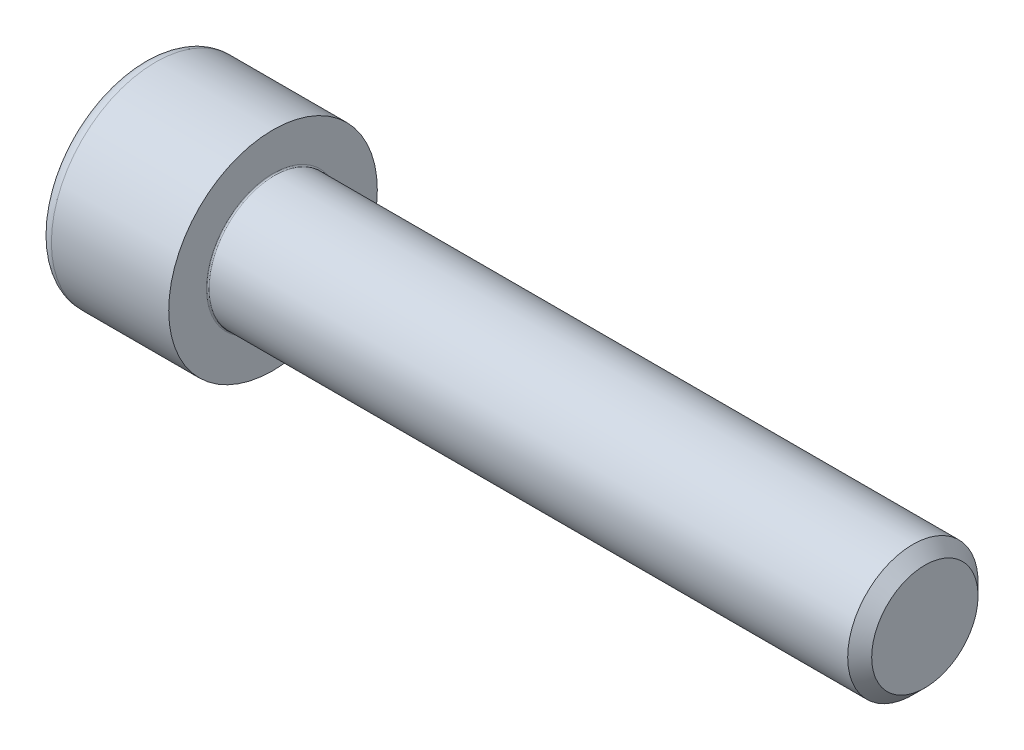
ISO-10303-21;
HEADER;
FILE_DESCRIPTION(('STEP AP214'),'2;1');
FILE_NAME('part.step','',(''),(''),'','','');
FILE_SCHEMA(('AUTOMOTIVE_DESIGN { 1 0 10303 214 1 1 1 1 }'));
ENDSEC;
DATA;
#1=APPLICATION_CONTEXT('core data for automotive mechanical design processes');
#2=APPLICATION_PROTOCOL_DEFINITION('international standard','automotive_design',2000,#1);
#3=PRODUCT_CONTEXT('',#1,'mechanical');
#4=PRODUCT('Part','Part','',(#3));
#5=PRODUCT_RELATED_PRODUCT_CATEGORY('part','',(#4));
#6=PRODUCT_DEFINITION_FORMATION('','',#4);
#7=PRODUCT_DEFINITION_CONTEXT('part definition',#1,'design');
#8=PRODUCT_DEFINITION('design','',#6,#7);
#9=PRODUCT_DEFINITION_SHAPE('','',#8);
#10=(LENGTH_UNIT() NAMED_UNIT(*) SI_UNIT(.MILLI.,.METRE.));
#11=(NAMED_UNIT(*) PLANE_ANGLE_UNIT() SI_UNIT($,.RADIAN.));
#12=(NAMED_UNIT(*) SI_UNIT($,.STERADIAN.) SOLID_ANGLE_UNIT());
#13=UNCERTAINTY_MEASURE_WITH_UNIT(LENGTH_MEASURE(1.E-05),#10,'distance_accuracy_value','');
#14=(GEOMETRIC_REPRESENTATION_CONTEXT(3) GLOBAL_UNCERTAINTY_ASSIGNED_CONTEXT((#13)) GLOBAL_UNIT_ASSIGNED_CONTEXT((#10,
#11,#12)) REPRESENTATION_CONTEXT('',''));
#15=CARTESIAN_POINT('',(0.,0.,0.));
#16=DIRECTION('',(0.,0.,1.));
#17=DIRECTION('',(1.,0.,0.));
#18=AXIS2_PLACEMENT_3D('',#15,#16,#17);
#19=CARTESIAN_POINT('',(-5.01600000268354,0.,0.));
#20=DIRECTION('',(-1.,0.,0.));
#21=DIRECTION('',(0.,0.,1.));
#22=AXIS2_PLACEMENT_3D('',#19,#20,#21);
#23=CONICAL_SURFACE('',#22,4.64651496463375,1.04719754991928);
#24=CARTESIAN_POINT('',(-2.3333333294886,-2.27373675443232E-10,0.));
#25=VERTEX_POINT('',#24);
#26=VERTEX_LOOP('',#25);
#27=FACE_BOUND('',#26,.T.);
#28=CARTESIAN_POINT('',(-5.00000000298437,4.00000000067974,2.30940107589699));
#29=CARTESIAN_POINT('',(-4.94139109334909,4.00000000024413,2.10643269365816));
#30=CARTESIAN_POINT('',(-4.88808935726585,4.00000000006543,1.90171229126235));
#31=CARTESIAN_POINT('',(-4.79505277770829,3.99999999993441,1.48872688965628));
#32=CARTESIAN_POINT('',(-4.75535084345693,3.99999999998264,1.28045455488328));
#33=CARTESIAN_POINT('',(-4.6935519205199,4.00000000001693,0.866490899976153));
#34=CARTESIAN_POINT('',(-4.67104357779146,4.00000000000452,0.660863255615086));
#35=CARTESIAN_POINT('',(-4.64417833884907,3.99999999999549,0.248640925676743));
#36=CARTESIAN_POINT('',(-4.63979919055683,3.99999999999887,0.0420477373874973));
#37=CARTESIAN_POINT('',(-4.64893258300802,4.00000000000099,-0.343949471957239));
#38=CARTESIAN_POINT('',(-4.66020257317891,4.00000000000027,-0.523411415039717));
#39=CARTESIAN_POINT('',(-4.69591460428945,3.99999999999974,-0.88116616517895));
#40=CARTESIAN_POINT('',(-4.72036883244939,3.99999999999993,-1.0594577357811));
#41=CARTESIAN_POINT('',(-4.78149966971878,4.00000000000008,-1.41794949444256));
#42=CARTESIAN_POINT('',(-4.81843528755097,4.00000000000004,-1.59810433342007));
#43=CARTESIAN_POINT('',(-4.90226352494454,3.99999999999996,-1.95572777908572));
#44=CARTESIAN_POINT('',(-4.94913646084931,3.99999999999992,-2.13320096380937));
#45=CARTESIAN_POINT('',(-5.00000000342637,4.,-2.30940107588652));
#46=B_SPLINE_CURVE_WITH_KNOTS('',3,(#28,#29,#30,#31,#32,#33,#34,#35,#36,#37,#38,#39,#40,#41,#42,
#43,#44,#45),.UNSPECIFIED.,.F.,.F.,(4,2,2,2,2,2,2,2,4),(0.,0.634032023238744,1.26958763432741,
1.88941521265626,2.50848177821251,3.04741556518231,3.58684838701404,4.13824324394022,
4.68855594552163),.UNSPECIFIED.);
#47=CARTESIAN_POINT('',(-5.00000000339516,3.99999999957561,2.30940107651348));
#48=VERTEX_POINT('',#47);
#49=CARTESIAN_POINT('',(-5.00000000353662,4.,-2.30940107626845));
#50=VERTEX_POINT('',#49);
#51=EDGE_CURVE('E21',#48,#50,#46,.T.);
#52=ORIENTED_EDGE('',*,*,#51,.T.);
#53=CARTESIAN_POINT('',(-5.00000000298437,3.99999999959378,-2.30940107777793));
#54=CARTESIAN_POINT('',(-4.9413910933491,3.82422422419212,-2.4108852685201));
#55=CARTESIAN_POINT('',(-4.88808935726585,3.64693115495502,-2.51324546956325));
#56=CARTESIAN_POINT('',(-4.79505277770829,3.28927530570654,-2.71973817025281));
#57=CARTESIAN_POINT('',(-4.75535084345693,3.10890617291174,-2.82387433768108));
#58=CARTESIAN_POINT('',(-4.6935519205199,2.75040313153586,-3.03085616516434));
#59=CARTESIAN_POINT('',(-4.67104357779146,2.57232436779261,-3.13366998733412));
#60=CARTESIAN_POINT('',(-4.64417833884907,2.21532935805429,-3.33978115229548));
#61=CARTESIAN_POINT('',(-4.63979919055682,2.03641440874867,-3.44307774644303));
#62=CARTESIAN_POINT('',(-4.64893258300801,1.70213101966728,-3.63607635111723));
#63=CARTESIAN_POINT('',(-4.66020257317891,1.54671241794498,-3.72580732265784));
#64=CARTESIAN_POINT('',(-4.69591460428945,1.23688771599958,-3.904684697727));
#65=CARTESIAN_POINT('',(-4.72036883244939,1.08248268657759,-3.99383048302824));
#66=CARTESIAN_POINT('',(-4.78149966971878,0.77201971652948,-4.1730763623591));
#67=CARTESIAN_POINT('',(-4.81843528755097,0.616001049360245,-4.26315378184782));
#68=CARTESIAN_POINT('',(-4.90226352494454,0.306290060424829,-4.44196550468058));
#69=CARTESIAN_POINT('',(-4.9491364608493,0.152593773963596,-4.53070209704237));
#70=CARTESIAN_POINT('',(-5.00000000342637,7.55160598991748E-10,-4.61880215308101));
#71=B_SPLINE_CURVE_WITH_KNOTS('',3,(#53,#54,#55,#56,#57,#58,#59,#60,#61,#62,#63,#64,#65,#66,#67,
#68,#69,#70),.UNSPECIFIED.,.F.,.F.,(4,2,2,2,2,2,2,2,4),(0.,0.634032023238744,1.26958763432741,
1.88941521265626,2.50848177821251,3.04741556518231,3.58684838701404,4.13824324394023,
4.68855594552164),.UNSPECIFIED.);
#72=CARTESIAN_POINT('',(-5.00000000339516,0.,-4.61880215302696));
#73=VERTEX_POINT('',#72);
#74=EDGE_CURVE('E82',#50,#73,#71,.T.);
#75=ORIENTED_EDGE('',*,*,#74,.T.);
#76=CARTESIAN_POINT('',(-5.00000000298436,-1.08596315510547E-09,-4.61880215367492));
#77=CARTESIAN_POINT('',(-4.94139109334909,-0.175775776052015,-4.51731796217826));
#78=CARTESIAN_POINT('',(-4.88808935726585,-0.353068845110414,-4.41495776082559));
#79=CARTESIAN_POINT('',(-4.79505277770829,-0.710724694227875,-4.20846505990909));
#80=CARTESIAN_POINT('',(-4.75535084345693,-0.891093827070901,-4.10432889256436));
#81=CARTESIAN_POINT('',(-4.6935519205199,-1.24959686848108,-3.8973470651405));
#82=CARTESIAN_POINT('',(-4.67104357779146,-1.4276756322119,-3.79453324294921));
#83=CARTESIAN_POINT('',(-4.64417833884907,-1.78467064194121,-3.58842207797222));
#84=CARTESIAN_POINT('',(-4.63979919055682,-1.96358559125021,-3.48512548383053));
#85=CARTESIAN_POINT('',(-4.64893258300802,-2.2978689803337,-3.29212687915999));
#86=CARTESIAN_POINT('',(-4.66020257317891,-2.45328758205529,-3.20239590761813));
#87=CARTESIAN_POINT('',(-4.69591460428945,-2.76311228400015,-3.02351853254805));
#88=CARTESIAN_POINT('',(-4.72036883244939,-2.91751731342233,-2.93437274724714));
#89=CARTESIAN_POINT('',(-4.78149966971878,-3.2279802834706,-2.75512686791654));
#90=CARTESIAN_POINT('',(-4.81843528755097,-3.3839989506398,-2.66504944842776));
#91=CARTESIAN_POINT('',(-4.90226352494454,-3.69370993957513,-2.48623772559486));
#92=CARTESIAN_POINT('',(-4.94913646084931,-3.84740622603633,-2.397501133233));
#93=CARTESIAN_POINT('',(-5.00000000342637,-3.99999999924484,-2.3094010771945));
#94=B_SPLINE_CURVE_WITH_KNOTS('',3,(#76,#77,#78,#79,#80,#81,#82,#83,#84,#85,#86,#87,#88,#89,#90,
#91,#92,#93),.UNSPECIFIED.,.F.,.F.,(4,2,2,2,2,2,2,2,4),(0.,0.634032023238745,1.26958763432741,
1.88941521265626,2.50848177821251,3.04741556518231,3.58684838701404,4.13824324394023,
4.68855594552164),.UNSPECIFIED.);
#95=CARTESIAN_POINT('',(-5.00000000339516,-3.99999999957561,-2.30940107651348));
#96=VERTEX_POINT('',#95);
#97=EDGE_CURVE('E108',#73,#96,#94,.T.);
#98=ORIENTED_EDGE('',*,*,#97,.T.);
#99=CARTESIAN_POINT('',(-5.00000000298436,-4.00000000067974,-2.30940107589699));
#100=CARTESIAN_POINT('',(-4.94139109334909,-4.00000000024413,-2.10643269365816));
#101=CARTESIAN_POINT('',(-4.88808935726585,-4.00000000006543,-1.90171229126235));
#102=CARTESIAN_POINT('',(-4.79505277770829,-3.99999999993441,-1.48872688965628));
#103=CARTESIAN_POINT('',(-4.75535084345693,-3.99999999998264,-1.28045455488328));
#104=CARTESIAN_POINT('',(-4.6935519205199,-4.00000000001693,-0.866490899976154));
#105=CARTESIAN_POINT('',(-4.67104357779146,-4.00000000000451,-0.660863255615087));
#106=CARTESIAN_POINT('',(-4.64417833884907,-3.99999999999549,-0.248640925676745));
#107=CARTESIAN_POINT('',(-4.63979919055682,-3.99999999999887,-0.0420477373874991));
#108=CARTESIAN_POINT('',(-4.64893258300801,-4.00000000000098,0.343949471957237));
#109=CARTESIAN_POINT('',(-4.66020257317891,-4.00000000000027,0.523411415039715));
#110=CARTESIAN_POINT('',(-4.69591460428945,-3.99999999999973,0.881166165178948));
#111=CARTESIAN_POINT('',(-4.72036883244939,-3.99999999999992,1.05945773578109));
#112=CARTESIAN_POINT('',(-4.78149966971878,-4.00000000000008,1.41794949444256));
#113=CARTESIAN_POINT('',(-4.81843528755097,-4.00000000000004,1.59810433342007));
#114=CARTESIAN_POINT('',(-4.90226352494454,-3.99999999999996,1.95572777908572));
#115=CARTESIAN_POINT('',(-4.9491364608493,-3.99999999999992,2.13320096380937));
#116=CARTESIAN_POINT('',(-5.00000000342637,-4.,2.30940107588652));
#117=B_SPLINE_CURVE_WITH_KNOTS('',3,(#99,#100,#101,#102,#103,#104,#105,#106,#107,#108,#109,#110,
#111,#112,#113,#114,#115,#116),.UNSPECIFIED.,.F.,.F.,(4,2,2,2,2,2,2,2,4),(0.,0.634032023238745,
1.26958763432741,1.88941521265626,2.50848177821251,3.04741556518231,3.58684838701404,
4.13824324394023,4.68855594552164),.UNSPECIFIED.);
#118=CARTESIAN_POINT('',(-5.00000000339516,-3.99999999957561,2.30940107651348));
#119=VERTEX_POINT('',#118);
#120=EDGE_CURVE('E133',#96,#119,#117,.T.);
#121=ORIENTED_EDGE('',*,*,#120,.T.);
#122=CARTESIAN_POINT('',(-5.00000000298437,-3.99999999959378,2.30940107777793));
#123=CARTESIAN_POINT('',(-4.9413910933491,-3.82422422419212,2.4108852685201));
#124=CARTESIAN_POINT('',(-4.88808935726585,-3.64693115495502,2.51324546956325));
#125=CARTESIAN_POINT('',(-4.79505277770829,-3.28927530570654,2.71973817025281));
#126=CARTESIAN_POINT('',(-4.75535084345693,-3.10890617291174,2.82387433768108));
#127=CARTESIAN_POINT('',(-4.6935519205199,-2.75040313153586,3.03085616516434));
#128=CARTESIAN_POINT('',(-4.67104357779146,-2.57232436779261,3.13366998733412));
#129=CARTESIAN_POINT('',(-4.64417833884907,-2.21532935805429,3.33978115229548));
#130=CARTESIAN_POINT('',(-4.63979919055682,-2.03641440874867,3.44307774644303));
#131=CARTESIAN_POINT('',(-4.64893258300801,-1.70213101966728,3.63607635111723));
#132=CARTESIAN_POINT('',(-4.66020257317891,-1.54671241794498,3.72580732265784));
#133=CARTESIAN_POINT('',(-4.69591460428945,-1.23688771599958,3.904684697727));
#134=CARTESIAN_POINT('',(-4.72036883244939,-1.08248268657759,3.99383048302824));
#135=CARTESIAN_POINT('',(-4.78149966971878,-0.772019716529482,4.1730763623591));
#136=CARTESIAN_POINT('',(-4.81843528755097,-0.616001049360246,4.26315378184782));
#137=CARTESIAN_POINT('',(-4.90226352494454,-0.306290060424831,4.44196550468058));
#138=CARTESIAN_POINT('',(-4.9491364608493,-0.152593773963598,4.53070209704237));
#139=CARTESIAN_POINT('',(-5.00000000342637,-7.55162327957336E-10,4.61880215308101));
#140=B_SPLINE_CURVE_WITH_KNOTS('',3,(#122,#123,#124,#125,#126,#127,#128,#129,#130,#131,#132,
#133,#134,#135,#136,#137,#138,#139),.UNSPECIFIED.,.F.,.F.,(4,2,2,2,2,2,2,2,4),(0.,
0.634032023238745,1.26958763432741,1.88941521265626,2.50848177821251,3.04741556518231,
3.58684838701404,4.13824324394023,4.68855594552164),.UNSPECIFIED.);
#141=CARTESIAN_POINT('',(-5.00000000339516,0.,4.61880215302696));
#142=VERTEX_POINT('',#141);
#143=EDGE_CURVE('E142',#119,#142,#140,.T.);
#144=ORIENTED_EDGE('',*,*,#143,.T.);
#145=CARTESIAN_POINT('',(-5.00000000298437,1.08596172823605E-09,4.61880215367492));
#146=CARTESIAN_POINT('',(-4.9413910933491,0.175775776052014,4.51731796217826));
#147=CARTESIAN_POINT('',(-4.88808935726585,0.353068845110412,4.41495776082559));
#148=CARTESIAN_POINT('',(-4.79505277770829,0.710724694227873,4.20846505990909));
#149=CARTESIAN_POINT('',(-4.75535084345693,0.8910938270709,4.10432889256436));
#150=CARTESIAN_POINT('',(-4.6935519205199,1.24959686848108,3.8973470651405));
#151=CARTESIAN_POINT('',(-4.67104357779146,1.4276756322119,3.79453324294921));
#152=CARTESIAN_POINT('',(-4.64417833884907,1.78467064194121,3.58842207797222));
#153=CARTESIAN_POINT('',(-4.63979919055682,1.9635855912502,3.48512548383053));
#154=CARTESIAN_POINT('',(-4.64893258300802,2.2978689803337,3.29212687915999));
#155=CARTESIAN_POINT('',(-4.66020257317891,2.45328758205529,3.20239590761813));
#156=CARTESIAN_POINT('',(-4.69591460428945,2.76311228400015,3.02351853254805));
#157=CARTESIAN_POINT('',(-4.72036883244939,2.91751731342233,2.93437274724714));
#158=CARTESIAN_POINT('',(-4.78149966971878,3.2279802834706,2.75512686791654));
#159=CARTESIAN_POINT('',(-4.81843528755097,3.38399895063979,2.66504944842776));
#160=CARTESIAN_POINT('',(-4.90226352494454,3.69370993957513,2.48623772559486));
#161=CARTESIAN_POINT('',(-4.94913646084931,3.84740622603633,2.397501133233));
#162=CARTESIAN_POINT('',(-5.00000000342637,3.99999999924484,2.3094010771945));
#163=B_SPLINE_CURVE_WITH_KNOTS('',3,(#145,#146,#147,#148,#149,#150,#151,#152,#153,#154,#155,
#156,#157,#158,#159,#160,#161,#162),.UNSPECIFIED.,.F.,.F.,(4,2,2,2,2,2,2,2,4),(0.,
0.634032023238745,1.26958763432741,1.88941521265626,2.50848177821251,3.04741556518231,
3.58684838701404,4.13824324394023,4.68855594552164),.UNSPECIFIED.);
#164=EDGE_CURVE('E84',#142,#48,#163,.T.);
#165=ORIENTED_EDGE('',*,*,#164,.T.);
#166=EDGE_LOOP('',(#52,#75,#98,#121,#144,#165));
#167=FACE_BOUND('',#166,.T.);
#168=ADVANCED_FACE('F17',(#27,#167),#23,.F.);
#169=CARTESIAN_POINT('',(-10.,4.,2.3094010767585));
#170=DIRECTION('',(0.,1.,0.));
#171=DIRECTION('',(0.,0.,1.));
#172=AXIS2_PLACEMENT_3D('',#169,#170,#171);
#173=PLANE('',#172);
#174=DIRECTION('',(1.,0.,0.));
#175=VECTOR('',#174,1.);
#176=CARTESIAN_POINT('',(-10.,4.,2.3094010767585));
#177=LINE('',#176,#175);
#178=CARTESIAN_POINT('',(-10.,4.,2.3094010767585));
#179=VERTEX_POINT('',#178);
#180=EDGE_CURVE('E86',#48,#179,#177,.F.);
#181=ORIENTED_EDGE('',*,*,#180,.T.);
#182=DIRECTION('',(0.,0.,1.));
#183=VECTOR('',#182,1.);
#184=CARTESIAN_POINT('',(-10.,4.,0.));
#185=LINE('',#184,#183);
#186=CARTESIAN_POINT('',(-10.,4.,-2.3094010767585));
#187=VERTEX_POINT('',#186);
#188=EDGE_CURVE('E91',#187,#179,#185,.T.);
#189=ORIENTED_EDGE('',*,*,#188,.F.);
#190=DIRECTION('',(1.,0.,0.));
#191=VECTOR('',#190,1.);
#192=CARTESIAN_POINT('',(-10.,4.,-2.3094010767585));
#193=LINE('',#192,#191);
#194=EDGE_CURVE('E89',#187,#50,#193,.T.);
#195=ORIENTED_EDGE('',*,*,#194,.T.);
#196=ORIENTED_EDGE('',*,*,#51,.F.);
#197=EDGE_LOOP('',(#181,#189,#195,#196));
#198=FACE_BOUND('',#197,.T.);
#199=ADVANCED_FACE('F78',(#198),#173,.F.);
#200=CARTESIAN_POINT('',(-10.,0.,4.61880215351701));
#201=DIRECTION('',(0.,0.5,0.866025403784439));
#202=DIRECTION('',(0.,-0.866025403784439,0.5));
#203=AXIS2_PLACEMENT_3D('',#200,#201,#202);
#204=PLANE('',#203);
#205=DIRECTION('',(1.,0.,0.));
#206=VECTOR('',#205,1.);
#207=CARTESIAN_POINT('',(-10.,0.,4.61880215351701));
#208=LINE('',#207,#206);
#209=CARTESIAN_POINT('',(-10.,0.,4.61880215351701));
#210=VERTEX_POINT('',#209);
#211=EDGE_CURVE('E147',#142,#210,#208,.F.);
#212=ORIENTED_EDGE('',*,*,#211,.T.);
#213=DIRECTION('',(0.,-0.866025403784438,0.5));
#214=VECTOR('',#213,1.);
#215=CARTESIAN_POINT('',(-10.,4.,2.3094010767585));
#216=LINE('',#215,#214);
#217=EDGE_CURVE('E97',#179,#210,#216,.T.);
#218=ORIENTED_EDGE('',*,*,#217,.F.);
#219=ORIENTED_EDGE('',*,*,#180,.F.);
#220=ORIENTED_EDGE('',*,*,#164,.F.);
#221=EDGE_LOOP('',(#212,#218,#219,#220));
#222=FACE_BOUND('',#221,.T.);
#223=ADVANCED_FACE('F152',(#222),#204,.F.);
#224=CARTESIAN_POINT('',(-10.,-4.,2.3094010767585));
#225=DIRECTION('',(0.,-0.5,0.866025403784439));
#226=DIRECTION('',(0.,-0.866025403784439,-0.5));
#227=AXIS2_PLACEMENT_3D('',#224,#225,#226);
#228=PLANE('',#227);
#229=DIRECTION('',(1.,0.,0.));
#230=VECTOR('',#229,1.);
#231=CARTESIAN_POINT('',(-10.,-4.,2.3094010767585));
#232=LINE('',#231,#230);
#233=CARTESIAN_POINT('',(-10.,-4.,2.3094010767585));
#234=VERTEX_POINT('',#233);
#235=EDGE_CURVE('E141',#119,#234,#232,.F.);
#236=ORIENTED_EDGE('',*,*,#235,.T.);
#237=DIRECTION('',(0.,-0.866025403784439,-0.5));
#238=VECTOR('',#237,1.);
#239=CARTESIAN_POINT('',(-10.,0.,4.61880215351701));
#240=LINE('',#239,#238);
#241=EDGE_CURVE('E271',#210,#234,#240,.T.);
#242=ORIENTED_EDGE('',*,*,#241,.F.);
#243=ORIENTED_EDGE('',*,*,#211,.F.);
#244=ORIENTED_EDGE('',*,*,#143,.F.);
#245=EDGE_LOOP('',(#236,#242,#243,#244));
#246=FACE_BOUND('',#245,.T.);
#247=ADVANCED_FACE('F129',(#246),#228,.F.);
#248=CARTESIAN_POINT('',(-10.,-4.,-2.3094010767585));
#249=DIRECTION('',(0.,-1.,0.));
#250=DIRECTION('',(0.,0.,-1.));
#251=AXIS2_PLACEMENT_3D('',#248,#249,#250);
#252=PLANE('',#251);
#253=DIRECTION('',(1.,0.,0.));
#254=VECTOR('',#253,1.);
#255=CARTESIAN_POINT('',(-10.,-4.,-2.3094010767585));
#256=LINE('',#255,#254);
#257=CARTESIAN_POINT('',(-10.,-4.,-2.3094010767585));
#258=VERTEX_POINT('',#257);
#259=EDGE_CURVE('E140',#96,#258,#256,.F.);
#260=ORIENTED_EDGE('',*,*,#259,.T.);
#261=DIRECTION('',(0.,0.,1.));
#262=VECTOR('',#261,1.);
#263=CARTESIAN_POINT('',(-10.,-4.,0.));
#264=LINE('',#263,#262);
#265=EDGE_CURVE('E266',#234,#258,#264,.F.);
#266=ORIENTED_EDGE('',*,*,#265,.F.);
#267=ORIENTED_EDGE('',*,*,#235,.F.);
#268=ORIENTED_EDGE('',*,*,#120,.F.);
#269=EDGE_LOOP('',(#260,#266,#267,#268));
#270=FACE_BOUND('',#269,.T.);
#271=ADVANCED_FACE('F125',(#270),#252,.F.);
#272=CARTESIAN_POINT('',(-10.,0.,-4.61880215351701));
#273=DIRECTION('',(0.,-0.5,-0.866025403784439));
#274=DIRECTION('',(0.,0.866025403784439,-0.5));
#275=AXIS2_PLACEMENT_3D('',#272,#273,#274);
#276=PLANE('',#275);
#277=DIRECTION('',(1.,0.,0.));
#278=VECTOR('',#277,1.);
#279=CARTESIAN_POINT('',(-10.,0.,-4.61880215351701));
#280=LINE('',#279,#278);
#281=CARTESIAN_POINT('',(-10.,0.,-4.61880215351701));
#282=VERTEX_POINT('',#281);
#283=EDGE_CURVE('E40',#73,#282,#280,.F.);
#284=ORIENTED_EDGE('',*,*,#283,.T.);
#285=DIRECTION('',(0.,0.866025403784439,-0.5));
#286=VECTOR('',#285,1.);
#287=CARTESIAN_POINT('',(-10.,-4.,-2.3094010767585));
#288=LINE('',#287,#286);
#289=EDGE_CURVE('E261',#258,#282,#288,.T.);
#290=ORIENTED_EDGE('',*,*,#289,.F.);
#291=ORIENTED_EDGE('',*,*,#259,.F.);
#292=ORIENTED_EDGE('',*,*,#97,.F.);
#293=EDGE_LOOP('',(#284,#290,#291,#292));
#294=FACE_BOUND('',#293,.T.);
#295=ADVANCED_FACE('F119',(#294),#276,.F.);
#296=CARTESIAN_POINT('',(-10.,4.,-2.3094010767585));
#297=DIRECTION('',(0.,0.5,-0.866025403784439));
#298=DIRECTION('',(0.,0.866025403784439,0.5));
#299=AXIS2_PLACEMENT_3D('',#296,#297,#298);
#300=PLANE('',#299);
#301=ORIENTED_EDGE('',*,*,#194,.F.);
#302=DIRECTION('',(0.,0.866025403784439,0.5));
#303=VECTOR('',#302,1.);
#304=CARTESIAN_POINT('',(-10.,0.,-4.61880215351701));
#305=LINE('',#304,#303);
#306=EDGE_CURVE('E259',#282,#187,#305,.T.);
#307=ORIENTED_EDGE('',*,*,#306,.F.);
#308=ORIENTED_EDGE('',*,*,#283,.F.);
#309=ORIENTED_EDGE('',*,*,#74,.F.);
#310=EDGE_LOOP('',(#301,#307,#308,#309));
#311=FACE_BOUND('',#310,.T.);
#312=ADVANCED_FACE('F95',(#311),#300,.F.);
#313=CARTESIAN_POINT('',(-10.,6.3094010767585,0.));
#314=DIRECTION('',(-1.,0.,0.));
#315=DIRECTION('',(0.,0.,1.));
#316=AXIS2_PLACEMENT_3D('',#313,#314,#315);
#317=PLANE('',#316);
#318=ORIENTED_EDGE('',*,*,#289,.T.);
#319=ORIENTED_EDGE('',*,*,#306,.T.);
#320=ORIENTED_EDGE('',*,*,#188,.T.);
#321=ORIENTED_EDGE('',*,*,#217,.T.);
#322=ORIENTED_EDGE('',*,*,#241,.T.);
#323=ORIENTED_EDGE('',*,*,#265,.T.);
#324=EDGE_LOOP('',(#318,#319,#320,#321,#322,#323));
#325=FACE_BOUND('',#324,.T.);
#326=CARTESIAN_POINT('',(-10.,0.,0.));
#327=DIRECTION('',(1.,0.,0.));
#328=DIRECTION('',(0.,1.,0.));
#329=AXIS2_PLACEMENT_3D('',#326,#327,#328);
#330=CIRCLE('',#329,7.);
#331=CARTESIAN_POINT('',(-10.,7.,0.));
#332=VERTEX_POINT('',#331);
#333=EDGE_CURVE('E222',#332,#332,#330,.T.);
#334=ORIENTED_EDGE('',*,*,#333,.F.);
#335=EDGE_LOOP('',(#334));
#336=FACE_BOUND('',#335,.T.);
#337=ADVANCED_FACE('F118',(#325,#336),#317,.T.);
#338=CARTESIAN_POINT('',(-9.,0.,0.));
#339=DIRECTION('',(1.,0.,0.));
#340=DIRECTION('',(0.,0.,-1.));
#341=AXIS2_PLACEMENT_3D('',#338,#339,#340);
#342=TOROIDAL_SURFACE('',#341,7.,1.);
#343=CARTESIAN_POINT('',(-9.,0.,0.));
#344=DIRECTION('',(1.,0.,0.));
#345=DIRECTION('',(0.,1.,0.));
#346=AXIS2_PLACEMENT_3D('',#343,#344,#345);
#347=CIRCLE('',#346,8.);
#348=CARTESIAN_POINT('',(-9.,8.,0.));
#349=VERTEX_POINT('',#348);
#350=EDGE_CURVE('E286',#349,#349,#347,.T.);
#351=ORIENTED_EDGE('',*,*,#350,.F.);
#352=EDGE_LOOP('',(#351));
#353=FACE_BOUND('',#352,.T.);
#354=ORIENTED_EDGE('',*,*,#333,.T.);
#355=EDGE_LOOP('',(#354));
#356=FACE_BOUND('',#355,.T.);
#357=ADVANCED_FACE('F206',(#353,#356),#342,.T.);
#358=CARTESIAN_POINT('',(-5.,0.,0.));
#359=DIRECTION('',(1.,0.,0.));
#360=DIRECTION('',(0.,1.,0.));
#361=AXIS2_PLACEMENT_3D('',#358,#359,#360);
#362=CYLINDRICAL_SURFACE('',#361,8.);
#363=ORIENTED_EDGE('',*,*,#350,.T.);
#364=EDGE_LOOP('',(#363));
#365=FACE_BOUND('',#364,.T.);
#366=CARTESIAN_POINT('',(0.,0.,0.));
#367=DIRECTION('',(1.,0.,0.));
#368=DIRECTION('',(0.,1.,0.));
#369=AXIS2_PLACEMENT_3D('',#366,#367,#368);
#370=CIRCLE('',#369,8.);
#371=CARTESIAN_POINT('',(0.,8.,0.));
#372=VERTEX_POINT('',#371);
#373=EDGE_CURVE('E106',#372,#372,#370,.T.);
#374=ORIENTED_EDGE('',*,*,#373,.F.);
#375=EDGE_LOOP('',(#374));
#376=FACE_BOUND('',#375,.T.);
#377=ADVANCED_FACE('F203',(#365,#376),#362,.T.);
#378=CARTESIAN_POINT('',(50.,2.5,0.));
#379=DIRECTION('',(1.,0.,0.));
#380=DIRECTION('',(0.,0.,-1.));
#381=AXIS2_PLACEMENT_3D('',#378,#379,#380);
#382=PLANE('',#381);
#383=CARTESIAN_POINT('',(50.0000000004093,0.,0.));
#384=DIRECTION('',(-1.,0.,0.));
#385=DIRECTION('',(0.,0.,1.));
#386=AXIS2_PLACEMENT_3D('',#383,#384,#385);
#387=CIRCLE('',#386,4.07982500041726);
#388=CARTESIAN_POINT('',(50.0000000004093,0.,4.07982500041726));
#389=VERTEX_POINT('',#388);
#390=EDGE_CURVE('E281',#389,#389,#387,.T.);
#391=ORIENTED_EDGE('',*,*,#390,.F.);
#392=EDGE_LOOP('',(#391));
#393=FACE_BOUND('',#392,.T.);
#394=ADVANCED_FACE('F200',(#393),#382,.T.);
#395=CARTESIAN_POINT('',(0.,6.5,0.));
#396=DIRECTION('',(1.,0.,0.));
#397=DIRECTION('',(0.,0.,-1.));
#398=AXIS2_PLACEMENT_3D('',#395,#396,#397);
#399=PLANE('',#398);
#400=CARTESIAN_POINT('',(0.,0.,0.));
#401=DIRECTION('',(1.,0.,0.));
#402=DIRECTION('',(0.,1.,0.));
#403=AXIS2_PLACEMENT_3D('',#400,#401,#402);
#404=CIRCLE('',#403,5.1);
#405=CARTESIAN_POINT('',(0.,5.1,0.));
#406=VERTEX_POINT('',#405);
#407=EDGE_CURVE('E187',#406,#406,#404,.F.);
#408=ORIENTED_EDGE('',*,*,#407,.T.);
#409=EDGE_LOOP('',(#408));
#410=FACE_BOUND('',#409,.T.);
#411=ORIENTED_EDGE('',*,*,#373,.T.);
#412=EDGE_LOOP('',(#411));
#413=FACE_BOUND('',#412,.T.);
#414=ADVANCED_FACE('F191',(#410,#413),#399,.T.);
#415=CARTESIAN_POINT('',(49.0798249995805,0.,0.));
#416=DIRECTION('',(-1.,0.,0.));
#417=DIRECTION('',(0.,0.,1.));
#418=AXIS2_PLACEMENT_3D('',#415,#416,#417);
#419=CONICAL_SURFACE('',#418,4.99999999959755,0.785398162501717);
#420=ORIENTED_EDGE('',*,*,#390,.T.);
#421=EDGE_LOOP('',(#420));
#422=FACE_BOUND('',#421,.T.);
#423=CARTESIAN_POINT('',(49.079825,0.,0.));
#424=DIRECTION('',(1.,0.,0.));
#425=DIRECTION('',(0.,1.,0.));
#426=AXIS2_PLACEMENT_3D('',#423,#424,#425);
#427=CIRCLE('',#426,5.);
#428=CARTESIAN_POINT('',(49.079825,5.,0.));
#429=VERTEX_POINT('',#428);
#430=EDGE_CURVE('E31',#429,#429,#427,.F.);
#431=ORIENTED_EDGE('',*,*,#430,.F.);
#432=EDGE_LOOP('',(#431));
#433=FACE_BOUND('',#432,.T.);
#434=ADVANCED_FACE('F169',(#422,#433),#419,.T.);
#435=CARTESIAN_POINT('',(0.100000000000002,0.,0.));
#436=DIRECTION('',(1.,0.,0.));
#437=DIRECTION('',(0.,0.,-1.));
#438=AXIS2_PLACEMENT_3D('',#435,#436,#437);
#439=TOROIDAL_SURFACE('',#438,5.1,0.1);
#440=CARTESIAN_POINT('',(0.100000000000003,0.,0.));
#441=DIRECTION('',(1.,0.,0.));
#442=DIRECTION('',(0.,1.,0.));
#443=AXIS2_PLACEMENT_3D('',#440,#441,#442);
#444=CIRCLE('',#443,5.);
#445=CARTESIAN_POINT('',(0.100000000000003,5.,0.));
#446=VERTEX_POINT('',#445);
#447=EDGE_CURVE('E11',#446,#446,#444,.T.);
#448=ORIENTED_EDGE('',*,*,#447,.F.);
#449=EDGE_LOOP('',(#448));
#450=FACE_BOUND('',#449,.T.);
#451=ORIENTED_EDGE('',*,*,#407,.F.);
#452=EDGE_LOOP('',(#451));
#453=FACE_BOUND('',#452,.T.);
#454=ADVANCED_FACE('F163',(#450,#453),#439,.F.);
#455=CARTESIAN_POINT('',(34.,0.,0.));
#456=DIRECTION('',(1.,0.,0.));
#457=DIRECTION('',(0.,1.,0.));
#458=AXIS2_PLACEMENT_3D('',#455,#456,#457);
#459=CYLINDRICAL_SURFACE('',#458,5.);
#460=ORIENTED_EDGE('',*,*,#447,.T.);
#461=EDGE_LOOP('',(#460));
#462=FACE_BOUND('',#461,.T.);
#463=ORIENTED_EDGE('',*,*,#430,.T.);
#464=EDGE_LOOP('',(#463));
#465=FACE_BOUND('',#464,.T.);
#466=ADVANCED_FACE('F161',(#462,#465),#459,.T.);
#467=CLOSED_SHELL('',(#168,#199,#223,#247,#271,#295,#312,#337,#357,#377,#394,#414,#434,#454,#466));
#468=MANIFOLD_SOLID_BREP('B1',#467);
#469=ADVANCED_BREP_SHAPE_REPRESENTATION('',(#18,#468),#14);
#470=SHAPE_DEFINITION_REPRESENTATION(#9,#469);
ENDSEC;
END-ISO-10303-21;
